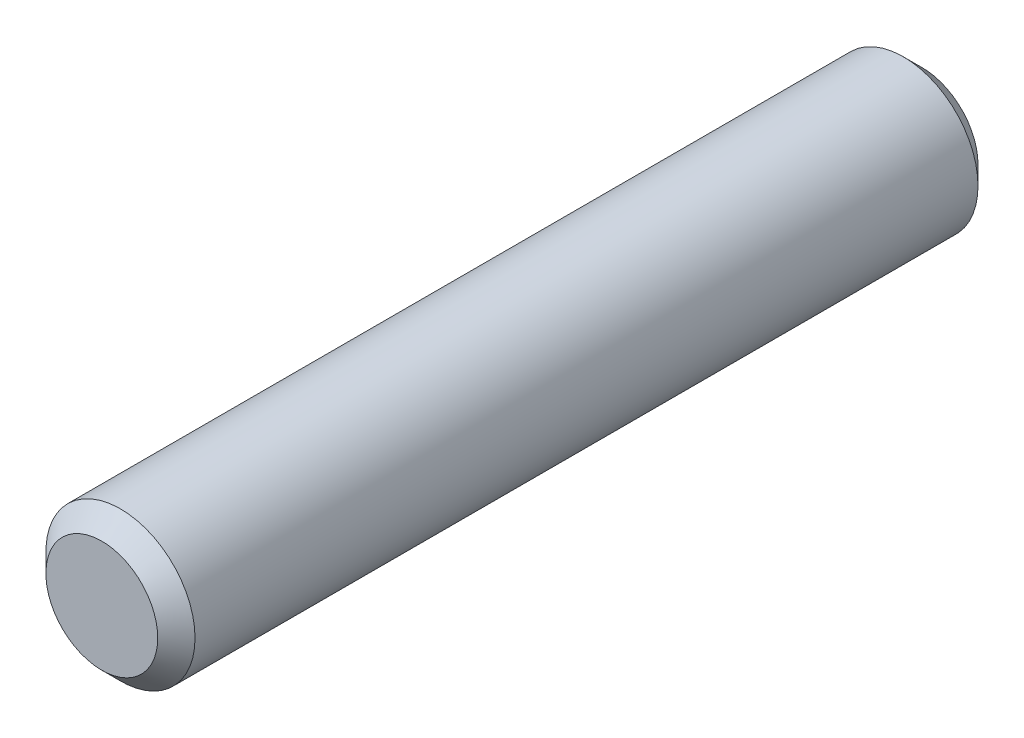
ISO-10303-21;
HEADER;
FILE_DESCRIPTION(('STEP AP214'),'2;1');
FILE_NAME('part.step','',(''),(''),'','','');
FILE_SCHEMA(('AUTOMOTIVE_DESIGN { 1 0 10303 214 1 1 1 1 }'));
ENDSEC;
DATA;
#1=APPLICATION_CONTEXT('core data for automotive mechanical design processes');
#2=APPLICATION_PROTOCOL_DEFINITION('international standard','automotive_design',2000,#1);
#3=PRODUCT_CONTEXT('',#1,'mechanical');
#4=PRODUCT('Part','Part','',(#3));
#5=PRODUCT_RELATED_PRODUCT_CATEGORY('part','',(#4));
#6=PRODUCT_DEFINITION_FORMATION('','',#4);
#7=PRODUCT_DEFINITION_CONTEXT('part definition',#1,'design');
#8=PRODUCT_DEFINITION('design','',#6,#7);
#9=PRODUCT_DEFINITION_SHAPE('','',#8);
#10=(LENGTH_UNIT() NAMED_UNIT(*) SI_UNIT(.MILLI.,.METRE.));
#11=(NAMED_UNIT(*) PLANE_ANGLE_UNIT() SI_UNIT($,.RADIAN.));
#12=(NAMED_UNIT(*) SI_UNIT($,.STERADIAN.) SOLID_ANGLE_UNIT());
#13=UNCERTAINTY_MEASURE_WITH_UNIT(LENGTH_MEASURE(1.E-05),#10,'distance_accuracy_value','');
#14=(GEOMETRIC_REPRESENTATION_CONTEXT(3) GLOBAL_UNCERTAINTY_ASSIGNED_CONTEXT((#13)) GLOBAL_UNIT_ASSIGNED_CONTEXT((#10,
#11,#12)) REPRESENTATION_CONTEXT('',''));
#15=CARTESIAN_POINT('',(0.,0.,0.));
#16=DIRECTION('',(0.,0.,1.));
#17=DIRECTION('',(1.,0.,0.));
#18=AXIS2_PLACEMENT_3D('',#15,#16,#17);
#19=CARTESIAN_POINT('',(0.,0.,22.));
#20=DIRECTION('',(0.,0.,-1.));
#21=DIRECTION('',(-1.,0.,0.));
#22=AXIS2_PLACEMENT_3D('',#19,#20,#21);
#23=CYLINDRICAL_SURFACE('',#22,2.);
#24=CARTESIAN_POINT('',(0.,0.,0.500000000000007));
#25=DIRECTION('',(0.,0.,1.));
#26=DIRECTION('',(1.,0.,0.));
#27=AXIS2_PLACEMENT_3D('',#24,#25,#26);
#28=CIRCLE('',#27,2.);
#29=CARTESIAN_POINT('',(2.,0.,0.500000000000007));
#30=VERTEX_POINT('',#29);
#31=EDGE_CURVE('E56',#30,#30,#28,.T.);
#32=ORIENTED_EDGE('',*,*,#31,.T.);
#33=EDGE_LOOP('',(#32));
#34=FACE_BOUND('',#33,.T.);
#35=CARTESIAN_POINT('',(0.,0.,21.5));
#36=DIRECTION('',(0.,0.,1.));
#37=DIRECTION('',(1.,0.,0.));
#38=AXIS2_PLACEMENT_3D('',#35,#36,#37);
#39=CIRCLE('',#38,2.);
#40=CARTESIAN_POINT('',(2.,0.,21.5));
#41=VERTEX_POINT('',#40);
#42=EDGE_CURVE('E62',#41,#41,#39,.F.);
#43=ORIENTED_EDGE('',*,*,#42,.T.);
#44=EDGE_LOOP('',(#43));
#45=FACE_BOUND('',#44,.T.);
#46=ADVANCED_FACE('F41',(#34,#45),#23,.T.);
#47=CARTESIAN_POINT('',(0.,0.,22.));
#48=DIRECTION('',(0.,0.,1.));
#49=DIRECTION('',(1.,0.,0.));
#50=AXIS2_PLACEMENT_3D('',#47,#48,#49);
#51=PLANE('',#50);
#52=CARTESIAN_POINT('',(0.,0.,22.));
#53=DIRECTION('',(0.,0.,1.));
#54=DIRECTION('',(1.,0.,0.));
#55=AXIS2_PLACEMENT_3D('',#52,#53,#54);
#56=CIRCLE('',#55,1.5);
#57=CARTESIAN_POINT('',(1.5,0.,22.));
#58=VERTEX_POINT('',#57);
#59=EDGE_CURVE('E10',#58,#58,#56,.T.);
#60=ORIENTED_EDGE('',*,*,#59,.T.);
#61=EDGE_LOOP('',(#60));
#62=FACE_BOUND('',#61,.T.);
#63=ADVANCED_FACE('F80',(#62),#51,.T.);
#64=CARTESIAN_POINT('',(0.,0.,0.));
#65=DIRECTION('',(0.,0.,1.));
#66=DIRECTION('',(1.,0.,0.));
#67=AXIS2_PLACEMENT_3D('',#64,#65,#66);
#68=PLANE('',#67);
#69=CARTESIAN_POINT('',(0.,0.,0.));
#70=DIRECTION('',(0.,0.,1.));
#71=DIRECTION('',(1.,0.,0.));
#72=AXIS2_PLACEMENT_3D('',#69,#70,#71);
#73=CIRCLE('',#72,1.49999999999999);
#74=CARTESIAN_POINT('',(1.49999999999999,0.,0.));
#75=VERTEX_POINT('',#74);
#76=EDGE_CURVE('E50',#75,#75,#73,.F.);
#77=ORIENTED_EDGE('',*,*,#76,.T.);
#78=EDGE_LOOP('',(#77));
#79=FACE_BOUND('',#78,.T.);
#80=ADVANCED_FACE('F77',(#79),#68,.F.);
#81=CARTESIAN_POINT('',(0.,0.,0.500000000000007));
#82=DIRECTION('',(0.,0.,1.));
#83=DIRECTION('',(1.,0.,0.));
#84=AXIS2_PLACEMENT_3D('',#81,#82,#83);
#85=CONICAL_SURFACE('',#84,2.,0.78539816339745);
#86=ORIENTED_EDGE('',*,*,#76,.F.);
#87=EDGE_LOOP('',(#86));
#88=FACE_BOUND('',#87,.T.);
#89=ORIENTED_EDGE('',*,*,#31,.F.);
#90=EDGE_LOOP('',(#89));
#91=FACE_BOUND('',#90,.T.);
#92=ADVANCED_FACE('F73',(#88,#91),#85,.T.);
#93=CARTESIAN_POINT('',(0.,0.,22.));
#94=DIRECTION('',(0.,0.,-1.));
#95=DIRECTION('',(-1.,0.,0.));
#96=AXIS2_PLACEMENT_3D('',#93,#94,#95);
#97=CONICAL_SURFACE('',#96,1.5,0.78539816339745);
#98=ORIENTED_EDGE('',*,*,#42,.F.);
#99=EDGE_LOOP('',(#98));
#100=FACE_BOUND('',#99,.T.);
#101=ORIENTED_EDGE('',*,*,#59,.F.);
#102=EDGE_LOOP('',(#101));
#103=FACE_BOUND('',#102,.T.);
#104=ADVANCED_FACE('F44',(#100,#103),#97,.T.);
#105=CLOSED_SHELL('',(#46,#63,#80,#92,#104));
#106=MANIFOLD_SOLID_BREP('B2',#105);
#107=ADVANCED_BREP_SHAPE_REPRESENTATION('',(#18,#106),#14);
#108=SHAPE_DEFINITION_REPRESENTATION(#9,#107);
ENDSEC;
END-ISO-10303-21;
